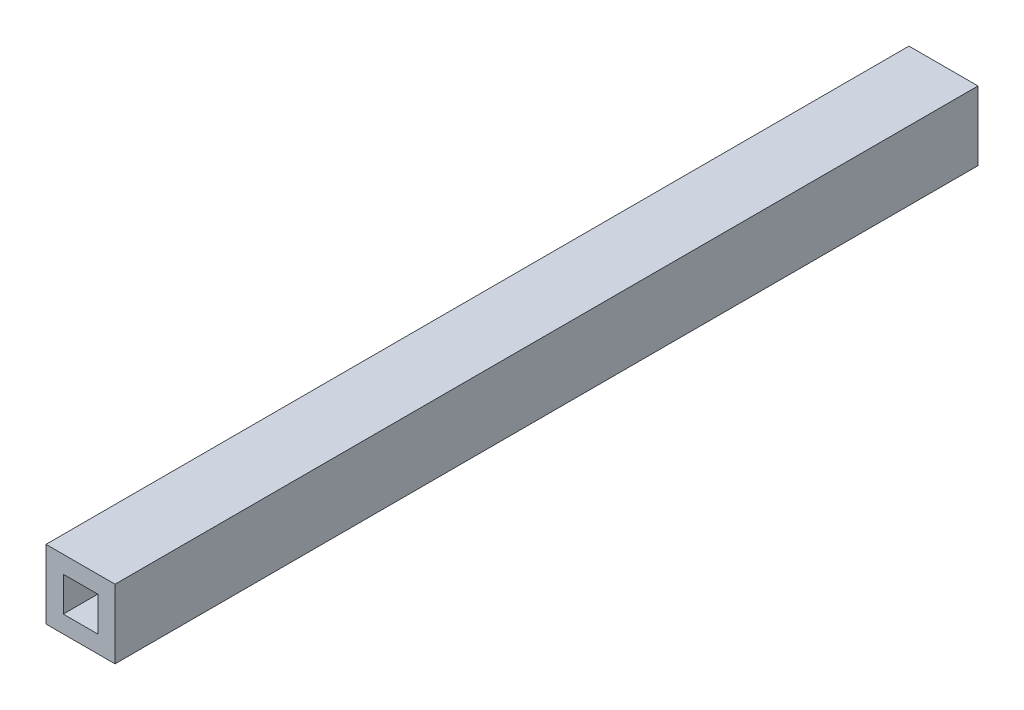
ISO-10303-21;
HEADER;
FILE_DESCRIPTION(('STEP AP214'),'2;1');
FILE_NAME('part.step','',(''),(''),'','','');
FILE_SCHEMA(('AUTOMOTIVE_DESIGN { 1 0 10303 214 1 1 1 1 }'));
ENDSEC;
DATA;
#1=APPLICATION_CONTEXT('core data for automotive mechanical design processes');
#2=APPLICATION_PROTOCOL_DEFINITION('international standard','automotive_design',2000,#1);
#3=PRODUCT_CONTEXT('',#1,'mechanical');
#4=PRODUCT('Part','Part','',(#3));
#5=PRODUCT_RELATED_PRODUCT_CATEGORY('part','',(#4));
#6=PRODUCT_DEFINITION_FORMATION('','',#4);
#7=PRODUCT_DEFINITION_CONTEXT('part definition',#1,'design');
#8=PRODUCT_DEFINITION('design','',#6,#7);
#9=PRODUCT_DEFINITION_SHAPE('','',#8);
#10=(LENGTH_UNIT() NAMED_UNIT(*) SI_UNIT(.MILLI.,.METRE.));
#11=(NAMED_UNIT(*) PLANE_ANGLE_UNIT() SI_UNIT($,.RADIAN.));
#12=(NAMED_UNIT(*) SI_UNIT($,.STERADIAN.) SOLID_ANGLE_UNIT());
#13=UNCERTAINTY_MEASURE_WITH_UNIT(LENGTH_MEASURE(1.E-05),#10,'distance_accuracy_value','');
#14=(GEOMETRIC_REPRESENTATION_CONTEXT(3) GLOBAL_UNCERTAINTY_ASSIGNED_CONTEXT((#13)) GLOBAL_UNIT_ASSIGNED_CONTEXT((#10,
#11,#12)) REPRESENTATION_CONTEXT('',''));
#15=CARTESIAN_POINT('',(0.,0.,0.));
#16=DIRECTION('',(0.,0.,1.));
#17=DIRECTION('',(1.,0.,0.));
#18=AXIS2_PLACEMENT_3D('',#15,#16,#17);
#19=CARTESIAN_POINT('',(0.,0.,250.));
#20=DIRECTION('',(0.,0.,1.));
#21=DIRECTION('',(1.,0.,0.));
#22=AXIS2_PLACEMENT_3D('',#19,#20,#21);
#23=PLANE('',#22);
#24=DIRECTION('',(0.,1.,0.));
#25=VECTOR('',#24,1.);
#26=CARTESIAN_POINT('',(10.,-10.,250.));
#27=LINE('',#26,#25);
#28=CARTESIAN_POINT('',(10.,-10.,250.));
#29=VERTEX_POINT('',#28);
#30=CARTESIAN_POINT('',(10.,10.,250.));
#31=VERTEX_POINT('',#30);
#32=EDGE_CURVE('E158',#29,#31,#27,.T.);
#33=ORIENTED_EDGE('',*,*,#32,.T.);
#34=DIRECTION('',(-1.,0.,0.));
#35=VECTOR('',#34,1.);
#36=CARTESIAN_POINT('',(-10.,10.,250.));
#37=LINE('',#36,#35);
#38=CARTESIAN_POINT('',(-10.,10.,250.));
#39=VERTEX_POINT('',#38);
#40=EDGE_CURVE('E161',#31,#39,#37,.T.);
#41=ORIENTED_EDGE('',*,*,#40,.T.);
#42=DIRECTION('',(0.,-1.,0.));
#43=VECTOR('',#42,1.);
#44=CARTESIAN_POINT('',(-10.,-10.,250.));
#45=LINE('',#44,#43);
#46=CARTESIAN_POINT('',(-10.,-10.,250.));
#47=VERTEX_POINT('',#46);
#48=EDGE_CURVE('E164',#39,#47,#45,.T.);
#49=ORIENTED_EDGE('',*,*,#48,.T.);
#50=DIRECTION('',(1.,0.,0.));
#51=VECTOR('',#50,1.);
#52=CARTESIAN_POINT('',(-10.,-10.,250.));
#53=LINE('',#52,#51);
#54=EDGE_CURVE('E166',#47,#29,#53,.T.);
#55=ORIENTED_EDGE('',*,*,#54,.T.);
#56=EDGE_LOOP('',(#33,#41,#49,#55));
#57=FACE_BOUND('',#56,.T.);
#58=DIRECTION('',(-1.,0.,0.));
#59=VECTOR('',#58,1.);
#60=CARTESIAN_POINT('',(0.,5.,250.));
#61=LINE('',#60,#59);
#62=CARTESIAN_POINT('',(5.,5.,250.));
#63=VERTEX_POINT('',#62);
#64=CARTESIAN_POINT('',(-5.,5.,250.));
#65=VERTEX_POINT('',#64);
#66=EDGE_CURVE('E130',#63,#65,#61,.T.);
#67=ORIENTED_EDGE('',*,*,#66,.F.);
#68=DIRECTION('',(0.,1.,0.));
#69=VECTOR('',#68,1.);
#70=CARTESIAN_POINT('',(5.,0.,250.));
#71=LINE('',#70,#69);
#72=CARTESIAN_POINT('',(5.,-5.,250.));
#73=VERTEX_POINT('',#72);
#74=EDGE_CURVE('E122',#73,#63,#71,.T.);
#75=ORIENTED_EDGE('',*,*,#74,.F.);
#76=DIRECTION('',(1.,0.,0.));
#77=VECTOR('',#76,1.);
#78=CARTESIAN_POINT('',(0.,-5.,250.));
#79=LINE('',#78,#77);
#80=CARTESIAN_POINT('',(-5.,-5.,250.));
#81=VERTEX_POINT('',#80);
#82=EDGE_CURVE('E144',#81,#73,#79,.T.);
#83=ORIENTED_EDGE('',*,*,#82,.F.);
#84=DIRECTION('',(0.,-1.,0.));
#85=VECTOR('',#84,1.);
#86=CARTESIAN_POINT('',(-5.,0.,250.));
#87=LINE('',#86,#85);
#88=EDGE_CURVE('E142',#65,#81,#87,.T.);
#89=ORIENTED_EDGE('',*,*,#88,.F.);
#90=EDGE_LOOP('',(#67,#75,#83,#89));
#91=FACE_BOUND('',#90,.T.);
#92=ADVANCED_FACE('F57',(#57,#91),#23,.T.);
#93=CARTESIAN_POINT('',(0.,0.,0.));
#94=DIRECTION('',(0.,0.,1.));
#95=DIRECTION('',(1.,0.,0.));
#96=AXIS2_PLACEMENT_3D('',#93,#94,#95);
#97=PLANE('',#96);
#98=DIRECTION('',(0.,1.,0.));
#99=VECTOR('',#98,1.);
#100=CARTESIAN_POINT('',(10.,-10.,0.));
#101=LINE('',#100,#99);
#102=CARTESIAN_POINT('',(10.,-10.,0.));
#103=VERTEX_POINT('',#102);
#104=CARTESIAN_POINT('',(10.,10.,0.));
#105=VERTEX_POINT('',#104);
#106=EDGE_CURVE('E138',#103,#105,#101,.T.);
#107=ORIENTED_EDGE('',*,*,#106,.F.);
#108=DIRECTION('',(1.,0.,0.));
#109=VECTOR('',#108,1.);
#110=CARTESIAN_POINT('',(-10.,-10.,0.));
#111=LINE('',#110,#109);
#112=CARTESIAN_POINT('',(-10.,-10.,0.));
#113=VERTEX_POINT('',#112);
#114=EDGE_CURVE('E162',#113,#103,#111,.T.);
#115=ORIENTED_EDGE('',*,*,#114,.F.);
#116=DIRECTION('',(0.,-1.,0.));
#117=VECTOR('',#116,1.);
#118=CARTESIAN_POINT('',(-10.,-10.,0.));
#119=LINE('',#118,#117);
#120=CARTESIAN_POINT('',(-10.,10.,0.));
#121=VERTEX_POINT('',#120);
#122=EDGE_CURVE('E173',#121,#113,#119,.T.);
#123=ORIENTED_EDGE('',*,*,#122,.F.);
#124=DIRECTION('',(-1.,0.,0.));
#125=VECTOR('',#124,1.);
#126=CARTESIAN_POINT('',(-10.,10.,0.));
#127=LINE('',#126,#125);
#128=EDGE_CURVE('E171',#105,#121,#127,.T.);
#129=ORIENTED_EDGE('',*,*,#128,.F.);
#130=EDGE_LOOP('',(#107,#115,#123,#129));
#131=FACE_BOUND('',#130,.T.);
#132=DIRECTION('',(0.,1.,0.));
#133=VECTOR('',#132,1.);
#134=CARTESIAN_POINT('',(5.,0.,0.));
#135=LINE('',#134,#133);
#136=CARTESIAN_POINT('',(5.,-5.,0.));
#137=VERTEX_POINT('',#136);
#138=CARTESIAN_POINT('',(5.,5.,0.));
#139=VERTEX_POINT('',#138);
#140=EDGE_CURVE('E80',#137,#139,#135,.T.);
#141=ORIENTED_EDGE('',*,*,#140,.T.);
#142=DIRECTION('',(-1.,0.,0.));
#143=VECTOR('',#142,1.);
#144=CARTESIAN_POINT('',(0.,5.,0.));
#145=LINE('',#144,#143);
#146=CARTESIAN_POINT('',(-5.,5.,0.));
#147=VERTEX_POINT('',#146);
#148=EDGE_CURVE('E137',#139,#147,#145,.T.);
#149=ORIENTED_EDGE('',*,*,#148,.T.);
#150=DIRECTION('',(0.,-1.,0.));
#151=VECTOR('',#150,1.);
#152=CARTESIAN_POINT('',(-5.,0.,0.));
#153=LINE('',#152,#151);
#154=CARTESIAN_POINT('',(-5.,-5.,0.));
#155=VERTEX_POINT('',#154);
#156=EDGE_CURVE('E150',#147,#155,#153,.T.);
#157=ORIENTED_EDGE('',*,*,#156,.T.);
#158=DIRECTION('',(1.,0.,0.));
#159=VECTOR('',#158,1.);
#160=CARTESIAN_POINT('',(0.,-5.,0.));
#161=LINE('',#160,#159);
#162=EDGE_CURVE('E131',#155,#137,#161,.T.);
#163=ORIENTED_EDGE('',*,*,#162,.T.);
#164=EDGE_LOOP('',(#141,#149,#157,#163));
#165=FACE_BOUND('',#164,.T.);
#166=ADVANCED_FACE('F191',(#131,#165),#97,.F.);
#167=CARTESIAN_POINT('',(10.,-10.,250.));
#168=DIRECTION('',(-1.,0.,0.));
#169=DIRECTION('',(0.,0.,1.));
#170=AXIS2_PLACEMENT_3D('',#167,#168,#169);
#171=PLANE('',#170);
#172=ORIENTED_EDGE('',*,*,#106,.T.);
#173=DIRECTION('',(0.,0.,-1.));
#174=VECTOR('',#173,1.);
#175=CARTESIAN_POINT('',(10.,10.,250.));
#176=LINE('',#175,#174);
#177=EDGE_CURVE('E12',#31,#105,#176,.T.);
#178=ORIENTED_EDGE('',*,*,#177,.F.);
#179=ORIENTED_EDGE('',*,*,#32,.F.);
#180=DIRECTION('',(0.,0.,-1.));
#181=VECTOR('',#180,1.);
#182=CARTESIAN_POINT('',(10.,-10.,250.));
#183=LINE('',#182,#181);
#184=EDGE_CURVE('E168',#29,#103,#183,.T.);
#185=ORIENTED_EDGE('',*,*,#184,.T.);
#186=EDGE_LOOP('',(#172,#178,#179,#185));
#187=FACE_BOUND('',#186,.T.);
#188=ADVANCED_FACE('F59',(#187),#171,.F.);
#189=CARTESIAN_POINT('',(-10.,10.,250.));
#190=DIRECTION('',(0.,-1.,0.));
#191=DIRECTION('',(0.,0.,-1.));
#192=AXIS2_PLACEMENT_3D('',#189,#190,#191);
#193=PLANE('',#192);
#194=ORIENTED_EDGE('',*,*,#128,.T.);
#195=DIRECTION('',(0.,0.,-1.));
#196=VECTOR('',#195,1.);
#197=CARTESIAN_POINT('',(-10.,10.,250.));
#198=LINE('',#197,#196);
#199=EDGE_CURVE('E65',#39,#121,#198,.T.);
#200=ORIENTED_EDGE('',*,*,#199,.F.);
#201=ORIENTED_EDGE('',*,*,#40,.F.);
#202=ORIENTED_EDGE('',*,*,#177,.T.);
#203=EDGE_LOOP('',(#194,#200,#201,#202));
#204=FACE_BOUND('',#203,.T.);
#205=ADVANCED_FACE('F201',(#204),#193,.F.);
#206=CARTESIAN_POINT('',(-10.,-10.,250.));
#207=DIRECTION('',(1.,0.,0.));
#208=DIRECTION('',(0.,0.,-1.));
#209=AXIS2_PLACEMENT_3D('',#206,#207,#208);
#210=PLANE('',#209);
#211=ORIENTED_EDGE('',*,*,#122,.T.);
#212=DIRECTION('',(0.,0.,-1.));
#213=VECTOR('',#212,1.);
#214=CARTESIAN_POINT('',(-10.,-10.,250.));
#215=LINE('',#214,#213);
#216=EDGE_CURVE('E178',#47,#113,#215,.T.);
#217=ORIENTED_EDGE('',*,*,#216,.F.);
#218=ORIENTED_EDGE('',*,*,#48,.F.);
#219=ORIENTED_EDGE('',*,*,#199,.T.);
#220=EDGE_LOOP('',(#211,#217,#218,#219));
#221=FACE_BOUND('',#220,.T.);
#222=ADVANCED_FACE('F185',(#221),#210,.F.);
#223=CARTESIAN_POINT('',(-10.,-10.,250.));
#224=DIRECTION('',(0.,1.,0.));
#225=DIRECTION('',(0.,0.,1.));
#226=AXIS2_PLACEMENT_3D('',#223,#224,#225);
#227=PLANE('',#226);
#228=ORIENTED_EDGE('',*,*,#114,.T.);
#229=ORIENTED_EDGE('',*,*,#184,.F.);
#230=ORIENTED_EDGE('',*,*,#54,.F.);
#231=ORIENTED_EDGE('',*,*,#216,.T.);
#232=EDGE_LOOP('',(#228,#229,#230,#231));
#233=FACE_BOUND('',#232,.T.);
#234=ADVANCED_FACE('F195',(#233),#227,.F.);
#235=CARTESIAN_POINT('',(5.,0.,250.));
#236=DIRECTION('',(-1.,0.,0.));
#237=DIRECTION('',(0.,0.,1.));
#238=AXIS2_PLACEMENT_3D('',#235,#236,#237);
#239=PLANE('',#238);
#240=ORIENTED_EDGE('',*,*,#140,.F.);
#241=DIRECTION('',(0.,0.,-1.));
#242=VECTOR('',#241,1.);
#243=CARTESIAN_POINT('',(5.,-5.,250.));
#244=LINE('',#243,#242);
#245=EDGE_CURVE('E126',#73,#137,#244,.T.);
#246=ORIENTED_EDGE('',*,*,#245,.F.);
#247=ORIENTED_EDGE('',*,*,#74,.T.);
#248=DIRECTION('',(0.,0.,-1.));
#249=VECTOR('',#248,1.);
#250=CARTESIAN_POINT('',(5.,5.,250.));
#251=LINE('',#250,#249);
#252=EDGE_CURVE('E125',#63,#139,#251,.T.);
#253=ORIENTED_EDGE('',*,*,#252,.T.);
#254=EDGE_LOOP('',(#240,#246,#247,#253));
#255=FACE_BOUND('',#254,.T.);
#256=ADVANCED_FACE('F124',(#255),#239,.T.);
#257=CARTESIAN_POINT('',(0.,5.,250.));
#258=DIRECTION('',(0.,-1.,0.));
#259=DIRECTION('',(0.,0.,-1.));
#260=AXIS2_PLACEMENT_3D('',#257,#258,#259);
#261=PLANE('',#260);
#262=ORIENTED_EDGE('',*,*,#148,.F.);
#263=ORIENTED_EDGE('',*,*,#252,.F.);
#264=ORIENTED_EDGE('',*,*,#66,.T.);
#265=DIRECTION('',(0.,0.,-1.));
#266=VECTOR('',#265,1.);
#267=CARTESIAN_POINT('',(-5.,5.,250.));
#268=LINE('',#267,#266);
#269=EDGE_CURVE('E139',#65,#147,#268,.T.);
#270=ORIENTED_EDGE('',*,*,#269,.T.);
#271=EDGE_LOOP('',(#262,#263,#264,#270));
#272=FACE_BOUND('',#271,.T.);
#273=ADVANCED_FACE('F134',(#272),#261,.T.);
#274=CARTESIAN_POINT('',(-5.,0.,250.));
#275=DIRECTION('',(1.,0.,0.));
#276=DIRECTION('',(0.,0.,-1.));
#277=AXIS2_PLACEMENT_3D('',#274,#275,#276);
#278=PLANE('',#277);
#279=ORIENTED_EDGE('',*,*,#156,.F.);
#280=ORIENTED_EDGE('',*,*,#269,.F.);
#281=ORIENTED_EDGE('',*,*,#88,.T.);
#282=DIRECTION('',(0.,0.,-1.));
#283=VECTOR('',#282,1.);
#284=CARTESIAN_POINT('',(-5.,-5.,250.));
#285=LINE('',#284,#283);
#286=EDGE_CURVE('E72',#81,#155,#285,.T.);
#287=ORIENTED_EDGE('',*,*,#286,.T.);
#288=EDGE_LOOP('',(#279,#280,#281,#287));
#289=FACE_BOUND('',#288,.T.);
#290=ADVANCED_FACE('F224',(#289),#278,.T.);
#291=CARTESIAN_POINT('',(0.,-5.,250.));
#292=DIRECTION('',(0.,1.,0.));
#293=DIRECTION('',(0.,0.,1.));
#294=AXIS2_PLACEMENT_3D('',#291,#292,#293);
#295=PLANE('',#294);
#296=ORIENTED_EDGE('',*,*,#162,.F.);
#297=ORIENTED_EDGE('',*,*,#286,.F.);
#298=ORIENTED_EDGE('',*,*,#82,.T.);
#299=ORIENTED_EDGE('',*,*,#245,.T.);
#300=EDGE_LOOP('',(#296,#297,#298,#299));
#301=FACE_BOUND('',#300,.T.);
#302=ADVANCED_FACE('F228',(#301),#295,.T.);
#303=CLOSED_SHELL('',(#92,#166,#188,#205,#222,#234,#256,#273,#290,#302));
#304=MANIFOLD_SOLID_BREP('B2',#303);
#305=ADVANCED_BREP_SHAPE_REPRESENTATION('',(#18,#304),#14);
#306=SHAPE_DEFINITION_REPRESENTATION(#9,#305);
ENDSEC;
END-ISO-10303-21;
